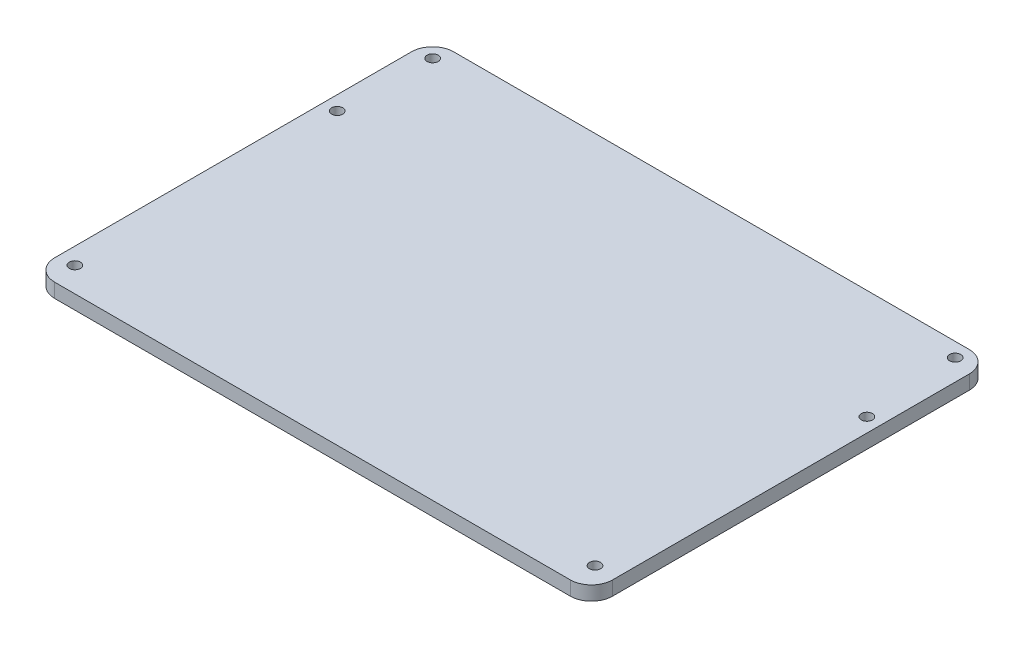
ISO-10303-21;
HEADER;
FILE_DESCRIPTION(('STEP AP214'),'2;1');
FILE_NAME('part.step','',(''),(''),'','','');
FILE_SCHEMA(('AUTOMOTIVE_DESIGN { 1 0 10303 214 1 1 1 1 }'));
ENDSEC;
DATA;
#1=APPLICATION_CONTEXT('core data for automotive mechanical design processes');
#2=APPLICATION_PROTOCOL_DEFINITION('international standard','automotive_design',2000,#1);
#3=PRODUCT_CONTEXT('',#1,'mechanical');
#4=PRODUCT('Part','Part','',(#3));
#5=PRODUCT_RELATED_PRODUCT_CATEGORY('part','',(#4));
#6=PRODUCT_DEFINITION_FORMATION('','',#4);
#7=PRODUCT_DEFINITION_CONTEXT('part definition',#1,'design');
#8=PRODUCT_DEFINITION('design','',#6,#7);
#9=PRODUCT_DEFINITION_SHAPE('','',#8);
#10=(LENGTH_UNIT() NAMED_UNIT(*) SI_UNIT(.MILLI.,.METRE.));
#11=(NAMED_UNIT(*) PLANE_ANGLE_UNIT() SI_UNIT($,.RADIAN.));
#12=(NAMED_UNIT(*) SI_UNIT($,.STERADIAN.) SOLID_ANGLE_UNIT());
#13=UNCERTAINTY_MEASURE_WITH_UNIT(LENGTH_MEASURE(1.E-05),#10,'distance_accuracy_value','');
#14=(GEOMETRIC_REPRESENTATION_CONTEXT(3) GLOBAL_UNCERTAINTY_ASSIGNED_CONTEXT((#13)) GLOBAL_UNIT_ASSIGNED_CONTEXT((#10,
#11,#12)) REPRESENTATION_CONTEXT('',''));
#15=CARTESIAN_POINT('',(0.,0.,0.));
#16=DIRECTION('',(0.,0.,1.));
#17=DIRECTION('',(1.,0.,0.));
#18=AXIS2_PLACEMENT_3D('',#15,#16,#17);
#19=CARTESIAN_POINT('',(-75.9922676579926,5.08,110.346003717472));
#20=DIRECTION('',(0.,1.,0.));
#21=DIRECTION('',(0.,0.,1.));
#22=AXIS2_PLACEMENT_3D('',#19,#20,#21);
#23=PLANE('',#22);
#24=CARTESIAN_POINT('',(109.427732342007,5.08,109.076003717472));
#25=DIRECTION('',(0.,1.,0.));
#26=DIRECTION('',(0.,0.,1.));
#27=AXIS2_PLACEMENT_3D('',#24,#25,#26);
#28=CIRCLE('',#27,2.);
#29=CARTESIAN_POINT('',(109.427732342007,5.08,111.076003717472));
#30=VERTEX_POINT('',#29);
#31=EDGE_CURVE('E192',#30,#30,#28,.T.);
#32=ORIENTED_EDGE('',*,*,#31,.F.);
#33=EDGE_LOOP('',(#32));
#34=FACE_BOUND('',#33,.T.);
#35=CARTESIAN_POINT('',(-77.6432676579926,5.08,109.076003717472));
#36=DIRECTION('',(0.,1.,0.));
#37=DIRECTION('',(0.,0.,1.));
#38=AXIS2_PLACEMENT_3D('',#35,#36,#37);
#39=CIRCLE('',#38,2.000000064);
#40=CARTESIAN_POINT('',(-77.6432676579926,5.08,111.076003781472));
#41=VERTEX_POINT('',#40);
#42=EDGE_CURVE('E199',#41,#41,#39,.T.);
#43=ORIENTED_EDGE('',*,*,#42,.F.);
#44=EDGE_LOOP('',(#43));
#45=FACE_BOUND('',#44,.T.);
#46=CARTESIAN_POINT('',(-78.5322676579926,5.08,13.8260037174722));
#47=DIRECTION('',(0.,1.,0.));
#48=DIRECTION('',(0.,0.,1.));
#49=AXIS2_PLACEMENT_3D('',#46,#47,#48);
#50=CIRCLE('',#49,2.);
#51=CARTESIAN_POINT('',(-78.5322676579926,5.08,15.8260037174722));
#52=VERTEX_POINT('',#51);
#53=EDGE_CURVE('E186',#52,#52,#50,.T.);
#54=ORIENTED_EDGE('',*,*,#53,.F.);
#55=EDGE_LOOP('',(#54));
#56=FACE_BOUND('',#55,.T.);
#57=CARTESIAN_POINT('',(-75.9922676579926,5.08,110.346003717472));
#58=DIRECTION('',(0.,1.,0.));
#59=DIRECTION('',(0.,0.,1.));
#60=AXIS2_PLACEMENT_3D('',#57,#58,#59);
#61=CIRCLE('',#60,7.62);
#62=CARTESIAN_POINT('',(-83.6122676579926,5.08,110.346003717472));
#63=VERTEX_POINT('',#62);
#64=CARTESIAN_POINT('',(-75.9922676579925,5.08,117.966003717472));
#65=VERTEX_POINT('',#64);
#66=EDGE_CURVE('E146',#63,#65,#61,.T.);
#67=ORIENTED_EDGE('',*,*,#66,.T.);
#68=DIRECTION('',(1.,0.,0.));
#69=VECTOR('',#68,1.);
#70=CARTESIAN_POINT('',(-75.9922676579925,5.08,117.966003717472));
#71=LINE('',#70,#69);
#72=CARTESIAN_POINT('',(109.427732342007,5.08,117.966003717472));
#73=VERTEX_POINT('',#72);
#74=EDGE_CURVE('E94',#65,#73,#71,.T.);
#75=ORIENTED_EDGE('',*,*,#74,.T.);
#76=CARTESIAN_POINT('',(109.427732342007,5.08,110.346003717472));
#77=DIRECTION('',(0.,1.,0.));
#78=DIRECTION('',(0.,0.,-1.));
#79=AXIS2_PLACEMENT_3D('',#76,#77,#78);
#80=CIRCLE('',#79,7.62000000000002);
#81=CARTESIAN_POINT('',(117.047732342007,5.08,110.346003717472));
#82=VERTEX_POINT('',#81);
#83=EDGE_CURVE('E161',#73,#82,#80,.T.);
#84=ORIENTED_EDGE('',*,*,#83,.T.);
#85=DIRECTION('',(0.,0.,-1.));
#86=VECTOR('',#85,1.);
#87=CARTESIAN_POINT('',(117.047732342007,5.08,-17.9239962825279));
#88=LINE('',#87,#86);
#89=CARTESIAN_POINT('',(117.047732342007,5.08,-17.9239962825279));
#90=VERTEX_POINT('',#89);
#91=EDGE_CURVE('E174',#82,#90,#88,.T.);
#92=ORIENTED_EDGE('',*,*,#91,.T.);
#93=CARTESIAN_POINT('',(109.427732342007,5.08,-17.9239962825279));
#94=DIRECTION('',(0.,1.,0.));
#95=DIRECTION('',(0.,0.,-1.));
#96=AXIS2_PLACEMENT_3D('',#93,#94,#95);
#97=CIRCLE('',#96,7.62000000000001);
#98=CARTESIAN_POINT('',(109.427732342007,5.08,-25.5439962825279));
#99=VERTEX_POINT('',#98);
#100=EDGE_CURVE('E113',#90,#99,#97,.T.);
#101=ORIENTED_EDGE('',*,*,#100,.T.);
#102=DIRECTION('',(-1.,0.,0.));
#103=VECTOR('',#102,1.);
#104=CARTESIAN_POINT('',(-75.9922676579926,5.08,-25.5439962825279));
#105=LINE('',#104,#103);
#106=CARTESIAN_POINT('',(-75.9922676579926,5.08,-25.5439962825279));
#107=VERTEX_POINT('',#106);
#108=EDGE_CURVE('E107',#99,#107,#105,.T.);
#109=ORIENTED_EDGE('',*,*,#108,.T.);
#110=CARTESIAN_POINT('',(-75.9922676579926,5.08,-17.9239962825279));
#111=DIRECTION('',(0.,1.,0.));
#112=DIRECTION('',(0.,0.,-1.));
#113=AXIS2_PLACEMENT_3D('',#110,#111,#112);
#114=CIRCLE('',#113,7.62);
#115=CARTESIAN_POINT('',(-83.6122676579926,5.08,-17.9239962825279));
#116=VERTEX_POINT('',#115);
#117=EDGE_CURVE('E111',#107,#116,#114,.T.);
#118=ORIENTED_EDGE('',*,*,#117,.T.);
#119=DIRECTION('',(0.,0.,1.));
#120=VECTOR('',#119,1.);
#121=CARTESIAN_POINT('',(-83.6122676579926,5.08,-17.9239962825279));
#122=LINE('',#121,#120);
#123=EDGE_CURVE('E51',#116,#63,#122,.T.);
#124=ORIENTED_EDGE('',*,*,#123,.T.);
#125=EDGE_LOOP('',(#67,#75,#84,#92,#101,#109,#118,#124));
#126=FACE_BOUND('',#125,.T.);
#127=CARTESIAN_POINT('',(-77.7702676579925,5.08,-19.7379191033778));
#128=DIRECTION('',(0.,1.,0.));
#129=DIRECTION('',(0.,0.,1.));
#130=AXIS2_PLACEMENT_3D('',#127,#128,#129);
#131=CIRCLE('',#130,2.);
#132=CARTESIAN_POINT('',(-77.7702676579925,5.08,-17.7379191033778));
#133=VERTEX_POINT('',#132);
#134=EDGE_CURVE('E180',#133,#133,#131,.T.);
#135=ORIENTED_EDGE('',*,*,#134,.F.);
#136=EDGE_LOOP('',(#135));
#137=FACE_BOUND('',#136,.T.);
#138=CARTESIAN_POINT('',(109.427732342007,5.08,-20.4639962825279));
#139=DIRECTION('',(0.,1.,0.));
#140=DIRECTION('',(0.,0.,1.));
#141=AXIS2_PLACEMENT_3D('',#138,#139,#140);
#142=CIRCLE('',#141,2.);
#143=CARTESIAN_POINT('',(109.427732342007,5.08,-18.4639962825279));
#144=VERTEX_POINT('',#143);
#145=EDGE_CURVE('E204',#144,#144,#142,.T.);
#146=ORIENTED_EDGE('',*,*,#145,.F.);
#147=EDGE_LOOP('',(#146));
#148=FACE_BOUND('',#147,.T.);
#149=CARTESIAN_POINT('',(111.967732342007,5.08,13.8260037174722));
#150=DIRECTION('',(0.,1.,0.));
#151=DIRECTION('',(0.,0.,1.));
#152=AXIS2_PLACEMENT_3D('',#149,#150,#151);
#153=CIRCLE('',#152,2.);
#154=CARTESIAN_POINT('',(111.967732342007,5.08,15.8260037174722));
#155=VERTEX_POINT('',#154);
#156=EDGE_CURVE('E210',#155,#155,#153,.F.);
#157=ORIENTED_EDGE('',*,*,#156,.T.);
#158=EDGE_LOOP('',(#157));
#159=FACE_BOUND('',#158,.T.);
#160=ADVANCED_FACE('F34',(#34,#45,#56,#126,#137,#148,#159),#23,.T.);
#161=CARTESIAN_POINT('',(-75.9922676579926,0.,110.346003717472));
#162=DIRECTION('',(0.,1.,0.));
#163=DIRECTION('',(0.,0.,1.));
#164=AXIS2_PLACEMENT_3D('',#161,#162,#163);
#165=PLANE('',#164);
#166=CARTESIAN_POINT('',(109.427732342007,0.,109.076003717472));
#167=DIRECTION('',(0.,1.,0.));
#168=DIRECTION('',(0.,0.,1.));
#169=AXIS2_PLACEMENT_3D('',#166,#167,#168);
#170=CIRCLE('',#169,2.);
#171=CARTESIAN_POINT('',(109.427732342007,0.,111.076003717472));
#172=VERTEX_POINT('',#171);
#173=EDGE_CURVE('E195',#172,#172,#170,.T.);
#174=ORIENTED_EDGE('',*,*,#173,.T.);
#175=EDGE_LOOP('',(#174));
#176=FACE_BOUND('',#175,.T.);
#177=CARTESIAN_POINT('',(-77.6432676579926,0.,109.076003717472));
#178=DIRECTION('',(0.,1.,0.));
#179=DIRECTION('',(0.,0.,1.));
#180=AXIS2_PLACEMENT_3D('',#177,#178,#179);
#181=CIRCLE('',#180,2.000000064);
#182=CARTESIAN_POINT('',(-77.6432676579926,0.,111.076003781472));
#183=VERTEX_POINT('',#182);
#184=EDGE_CURVE('E189',#183,#183,#181,.T.);
#185=ORIENTED_EDGE('',*,*,#184,.T.);
#186=EDGE_LOOP('',(#185));
#187=FACE_BOUND('',#186,.T.);
#188=CARTESIAN_POINT('',(-78.5322676579926,0.,13.8260037174722));
#189=DIRECTION('',(0.,1.,0.));
#190=DIRECTION('',(0.,0.,1.));
#191=AXIS2_PLACEMENT_3D('',#188,#189,#190);
#192=CIRCLE('',#191,2.);
#193=CARTESIAN_POINT('',(-78.5322676579926,0.,15.8260037174722));
#194=VERTEX_POINT('',#193);
#195=EDGE_CURVE('E183',#194,#194,#192,.T.);
#196=ORIENTED_EDGE('',*,*,#195,.T.);
#197=EDGE_LOOP('',(#196));
#198=FACE_BOUND('',#197,.T.);
#199=CARTESIAN_POINT('',(109.427732342007,0.,-20.4639962825279));
#200=DIRECTION('',(0.,1.,0.));
#201=DIRECTION('',(0.,0.,1.));
#202=AXIS2_PLACEMENT_3D('',#199,#200,#201);
#203=CIRCLE('',#202,2.);
#204=CARTESIAN_POINT('',(109.427732342007,0.,-18.4639962825279));
#205=VERTEX_POINT('',#204);
#206=EDGE_CURVE('E207',#205,#205,#203,.T.);
#207=ORIENTED_EDGE('',*,*,#206,.T.);
#208=EDGE_LOOP('',(#207));
#209=FACE_BOUND('',#208,.T.);
#210=CARTESIAN_POINT('',(-77.7702676579925,0.,-19.7379191033778));
#211=DIRECTION('',(0.,1.,0.));
#212=DIRECTION('',(0.,0.,1.));
#213=AXIS2_PLACEMENT_3D('',#210,#211,#212);
#214=CIRCLE('',#213,2.);
#215=CARTESIAN_POINT('',(-77.7702676579925,0.,-17.7379191033778));
#216=VERTEX_POINT('',#215);
#217=EDGE_CURVE('E135',#216,#216,#214,.T.);
#218=ORIENTED_EDGE('',*,*,#217,.T.);
#219=EDGE_LOOP('',(#218));
#220=FACE_BOUND('',#219,.T.);
#221=CARTESIAN_POINT('',(-75.9922676579926,0.,110.346003717472));
#222=DIRECTION('',(0.,1.,0.));
#223=DIRECTION('',(0.,0.,1.));
#224=AXIS2_PLACEMENT_3D('',#221,#222,#223);
#225=CIRCLE('',#224,7.62);
#226=CARTESIAN_POINT('',(-83.6122676579926,0.,110.346003717472));
#227=VERTEX_POINT('',#226);
#228=CARTESIAN_POINT('',(-75.9922676579925,0.,117.966003717472));
#229=VERTEX_POINT('',#228);
#230=EDGE_CURVE('E131',#227,#229,#225,.T.);
#231=ORIENTED_EDGE('',*,*,#230,.F.);
#232=DIRECTION('',(0.,0.,1.));
#233=VECTOR('',#232,1.);
#234=CARTESIAN_POINT('',(-83.6122676579926,0.,-17.9239962825279));
#235=LINE('',#234,#233);
#236=CARTESIAN_POINT('',(-83.6122676579926,0.,-17.9239962825279));
#237=VERTEX_POINT('',#236);
#238=EDGE_CURVE('E86',#237,#227,#235,.T.);
#239=ORIENTED_EDGE('',*,*,#238,.F.);
#240=CARTESIAN_POINT('',(-75.9922676579926,0.,-17.9239962825279));
#241=DIRECTION('',(0.,1.,0.));
#242=DIRECTION('',(0.,0.,-1.));
#243=AXIS2_PLACEMENT_3D('',#240,#241,#242);
#244=CIRCLE('',#243,7.62);
#245=CARTESIAN_POINT('',(-75.9922676579926,0.,-25.5439962825279));
#246=VERTEX_POINT('',#245);
#247=EDGE_CURVE('E80',#246,#237,#244,.T.);
#248=ORIENTED_EDGE('',*,*,#247,.F.);
#249=DIRECTION('',(-1.,0.,0.));
#250=VECTOR('',#249,1.);
#251=CARTESIAN_POINT('',(-75.9922676579926,0.,-25.5439962825279));
#252=LINE('',#251,#250);
#253=CARTESIAN_POINT('',(109.427732342007,0.,-25.5439962825279));
#254=VERTEX_POINT('',#253);
#255=EDGE_CURVE('E121',#254,#246,#252,.T.);
#256=ORIENTED_EDGE('',*,*,#255,.F.);
#257=CARTESIAN_POINT('',(109.427732342007,0.,-17.9239962825279));
#258=DIRECTION('',(0.,1.,0.));
#259=DIRECTION('',(0.,0.,-1.));
#260=AXIS2_PLACEMENT_3D('',#257,#258,#259);
#261=CIRCLE('',#260,7.62000000000001);
#262=CARTESIAN_POINT('',(117.047732342007,0.,-17.9239962825279));
#263=VERTEX_POINT('',#262);
#264=EDGE_CURVE('E141',#263,#254,#261,.T.);
#265=ORIENTED_EDGE('',*,*,#264,.F.);
#266=DIRECTION('',(0.,0.,-1.));
#267=VECTOR('',#266,1.);
#268=CARTESIAN_POINT('',(117.047732342007,0.,-17.9239962825279));
#269=LINE('',#268,#267);
#270=CARTESIAN_POINT('',(117.047732342007,0.,110.346003717472));
#271=VERTEX_POINT('',#270);
#272=EDGE_CURVE('E139',#271,#263,#269,.T.);
#273=ORIENTED_EDGE('',*,*,#272,.F.);
#274=CARTESIAN_POINT('',(109.427732342007,0.,110.346003717472));
#275=DIRECTION('',(0.,1.,0.));
#276=DIRECTION('',(0.,0.,-1.));
#277=AXIS2_PLACEMENT_3D('',#274,#275,#276);
#278=CIRCLE('',#277,7.62000000000002);
#279=CARTESIAN_POINT('',(109.427732342007,0.,117.966003717472));
#280=VERTEX_POINT('',#279);
#281=EDGE_CURVE('E137',#280,#271,#278,.T.);
#282=ORIENTED_EDGE('',*,*,#281,.F.);
#283=DIRECTION('',(1.,0.,0.));
#284=VECTOR('',#283,1.);
#285=CARTESIAN_POINT('',(-75.9922676579925,0.,117.966003717472));
#286=LINE('',#285,#284);
#287=EDGE_CURVE('E134',#229,#280,#286,.T.);
#288=ORIENTED_EDGE('',*,*,#287,.F.);
#289=EDGE_LOOP('',(#231,#239,#248,#256,#265,#273,#282,#288));
#290=FACE_BOUND('',#289,.T.);
#291=CARTESIAN_POINT('',(111.967732342007,0.,13.8260037174722));
#292=DIRECTION('',(0.,1.,0.));
#293=DIRECTION('',(0.,0.,1.));
#294=AXIS2_PLACEMENT_3D('',#291,#292,#293);
#295=CIRCLE('',#294,2.);
#296=CARTESIAN_POINT('',(111.967732342007,0.,15.8260037174722));
#297=VERTEX_POINT('',#296);
#298=EDGE_CURVE('E196',#297,#297,#295,.F.);
#299=ORIENTED_EDGE('',*,*,#298,.F.);
#300=EDGE_LOOP('',(#299));
#301=FACE_BOUND('',#300,.T.);
#302=ADVANCED_FACE('F165',(#176,#187,#198,#209,#220,#290,#301),#165,.F.);
#303=CARTESIAN_POINT('',(-75.9922676579926,5.08,110.346003717472));
#304=DIRECTION('',(0.,-1.,0.));
#305=DIRECTION('',(0.,0.,-1.));
#306=AXIS2_PLACEMENT_3D('',#303,#304,#305);
#307=CYLINDRICAL_SURFACE('',#306,7.62);
#308=ORIENTED_EDGE('',*,*,#230,.T.);
#309=DIRECTION('',(0.,-1.,0.));
#310=VECTOR('',#309,1.);
#311=CARTESIAN_POINT('',(-75.9922676579925,5.08,117.966003717472));
#312=LINE('',#311,#310);
#313=EDGE_CURVE('E11',#65,#229,#312,.T.);
#314=ORIENTED_EDGE('',*,*,#313,.F.);
#315=ORIENTED_EDGE('',*,*,#66,.F.);
#316=DIRECTION('',(0.,-1.,0.));
#317=VECTOR('',#316,1.);
#318=CARTESIAN_POINT('',(-83.6122676579926,5.08,110.346003717472));
#319=LINE('',#318,#317);
#320=EDGE_CURVE('E127',#63,#227,#319,.T.);
#321=ORIENTED_EDGE('',*,*,#320,.T.);
#322=EDGE_LOOP('',(#308,#314,#315,#321));
#323=FACE_BOUND('',#322,.T.);
#324=ADVANCED_FACE('F36',(#323),#307,.T.);
#325=CARTESIAN_POINT('',(-75.9922676579925,5.08,117.966003717472));
#326=DIRECTION('',(0.,0.,-1.));
#327=DIRECTION('',(-1.,0.,0.));
#328=AXIS2_PLACEMENT_3D('',#325,#326,#327);
#329=PLANE('',#328);
#330=ORIENTED_EDGE('',*,*,#287,.T.);
#331=DIRECTION('',(0.,-1.,0.));
#332=VECTOR('',#331,1.);
#333=CARTESIAN_POINT('',(109.427732342007,5.08,117.966003717472));
#334=LINE('',#333,#332);
#335=EDGE_CURVE('E43',#73,#280,#334,.T.);
#336=ORIENTED_EDGE('',*,*,#335,.F.);
#337=ORIENTED_EDGE('',*,*,#74,.F.);
#338=ORIENTED_EDGE('',*,*,#313,.T.);
#339=EDGE_LOOP('',(#330,#336,#337,#338));
#340=FACE_BOUND('',#339,.T.);
#341=ADVANCED_FACE('F225',(#340),#329,.F.);
#342=CARTESIAN_POINT('',(109.427732342007,5.08,110.346003717472));
#343=DIRECTION('',(0.,-1.,0.));
#344=DIRECTION('',(0.,0.,-1.));
#345=AXIS2_PLACEMENT_3D('',#342,#343,#344);
#346=CYLINDRICAL_SURFACE('',#345,7.62000000000002);
#347=ORIENTED_EDGE('',*,*,#281,.T.);
#348=DIRECTION('',(0.,-1.,0.));
#349=VECTOR('',#348,1.);
#350=CARTESIAN_POINT('',(117.047732342007,5.08,110.346003717472));
#351=LINE('',#350,#349);
#352=EDGE_CURVE('E153',#82,#271,#351,.T.);
#353=ORIENTED_EDGE('',*,*,#352,.F.);
#354=ORIENTED_EDGE('',*,*,#83,.F.);
#355=ORIENTED_EDGE('',*,*,#335,.T.);
#356=EDGE_LOOP('',(#347,#353,#354,#355));
#357=FACE_BOUND('',#356,.T.);
#358=ADVANCED_FACE('F159',(#357),#346,.T.);
#359=CARTESIAN_POINT('',(117.047732342007,5.08,-17.9239962825279));
#360=DIRECTION('',(-1.,0.,0.));
#361=DIRECTION('',(0.,0.,1.));
#362=AXIS2_PLACEMENT_3D('',#359,#360,#361);
#363=PLANE('',#362);
#364=ORIENTED_EDGE('',*,*,#272,.T.);
#365=DIRECTION('',(0.,-1.,0.));
#366=VECTOR('',#365,1.);
#367=CARTESIAN_POINT('',(117.047732342007,5.08,-17.9239962825279));
#368=LINE('',#367,#366);
#369=EDGE_CURVE('E150',#90,#263,#368,.T.);
#370=ORIENTED_EDGE('',*,*,#369,.F.);
#371=ORIENTED_EDGE('',*,*,#91,.F.);
#372=ORIENTED_EDGE('',*,*,#352,.T.);
#373=EDGE_LOOP('',(#364,#370,#371,#372));
#374=FACE_BOUND('',#373,.T.);
#375=ADVANCED_FACE('F170',(#374),#363,.F.);
#376=CARTESIAN_POINT('',(109.427732342007,5.08,-17.9239962825279));
#377=DIRECTION('',(0.,-1.,0.));
#378=DIRECTION('',(0.,0.,-1.));
#379=AXIS2_PLACEMENT_3D('',#376,#377,#378);
#380=CYLINDRICAL_SURFACE('',#379,7.62000000000001);
#381=ORIENTED_EDGE('',*,*,#264,.T.);
#382=DIRECTION('',(0.,-1.,0.));
#383=VECTOR('',#382,1.);
#384=CARTESIAN_POINT('',(109.427732342007,5.08,-25.5439962825279));
#385=LINE('',#384,#383);
#386=EDGE_CURVE('E122',#99,#254,#385,.T.);
#387=ORIENTED_EDGE('',*,*,#386,.F.);
#388=ORIENTED_EDGE('',*,*,#100,.F.);
#389=ORIENTED_EDGE('',*,*,#369,.T.);
#390=EDGE_LOOP('',(#381,#387,#388,#389));
#391=FACE_BOUND('',#390,.T.);
#392=ADVANCED_FACE('F173',(#391),#380,.T.);
#393=CARTESIAN_POINT('',(-75.9922676579926,5.08,-25.5439962825279));
#394=DIRECTION('',(0.,0.,1.));
#395=DIRECTION('',(1.,0.,0.));
#396=AXIS2_PLACEMENT_3D('',#393,#394,#395);
#397=PLANE('',#396);
#398=ORIENTED_EDGE('',*,*,#255,.T.);
#399=DIRECTION('',(0.,-1.,0.));
#400=VECTOR('',#399,1.);
#401=CARTESIAN_POINT('',(-75.9922676579926,5.08,-25.5439962825279));
#402=LINE('',#401,#400);
#403=EDGE_CURVE('E118',#107,#246,#402,.T.);
#404=ORIENTED_EDGE('',*,*,#403,.F.);
#405=ORIENTED_EDGE('',*,*,#108,.F.);
#406=ORIENTED_EDGE('',*,*,#386,.T.);
#407=EDGE_LOOP('',(#398,#404,#405,#406));
#408=FACE_BOUND('',#407,.T.);
#409=ADVANCED_FACE('F119',(#408),#397,.F.);
#410=CARTESIAN_POINT('',(-75.9922676579926,5.08,-17.9239962825279));
#411=DIRECTION('',(0.,-1.,0.));
#412=DIRECTION('',(0.,0.,-1.));
#413=AXIS2_PLACEMENT_3D('',#410,#411,#412);
#414=CYLINDRICAL_SURFACE('',#413,7.62);
#415=ORIENTED_EDGE('',*,*,#247,.T.);
#416=DIRECTION('',(0.,-1.,0.));
#417=VECTOR('',#416,1.);
#418=CARTESIAN_POINT('',(-83.6122676579926,5.08,-17.9239962825279));
#419=LINE('',#418,#417);
#420=EDGE_CURVE('E123',#116,#237,#419,.T.);
#421=ORIENTED_EDGE('',*,*,#420,.F.);
#422=ORIENTED_EDGE('',*,*,#117,.F.);
#423=ORIENTED_EDGE('',*,*,#403,.T.);
#424=EDGE_LOOP('',(#415,#421,#422,#423));
#425=FACE_BOUND('',#424,.T.);
#426=ADVANCED_FACE('F125',(#425),#414,.T.);
#427=CARTESIAN_POINT('',(-83.6122676579926,5.08,-17.9239962825279));
#428=DIRECTION('',(1.,0.,0.));
#429=DIRECTION('',(0.,0.,-1.));
#430=AXIS2_PLACEMENT_3D('',#427,#428,#429);
#431=PLANE('',#430);
#432=ORIENTED_EDGE('',*,*,#238,.T.);
#433=ORIENTED_EDGE('',*,*,#320,.F.);
#434=ORIENTED_EDGE('',*,*,#123,.F.);
#435=ORIENTED_EDGE('',*,*,#420,.T.);
#436=EDGE_LOOP('',(#432,#433,#434,#435));
#437=FACE_BOUND('',#436,.T.);
#438=ADVANCED_FACE('F232',(#437),#431,.F.);
#439=CARTESIAN_POINT('',(-77.7702676579925,0.,-19.7379191033778));
#440=DIRECTION('',(0.,1.,0.));
#441=DIRECTION('',(0.,0.,1.));
#442=AXIS2_PLACEMENT_3D('',#439,#440,#441);
#443=CYLINDRICAL_SURFACE('',#442,2.);
#444=ORIENTED_EDGE('',*,*,#217,.F.);
#445=EDGE_LOOP('',(#444));
#446=FACE_BOUND('',#445,.T.);
#447=ORIENTED_EDGE('',*,*,#134,.T.);
#448=EDGE_LOOP('',(#447));
#449=FACE_BOUND('',#448,.T.);
#450=ADVANCED_FACE('F235',(#446,#449),#443,.F.);
#451=CARTESIAN_POINT('',(109.427732342007,0.,-20.4639962825279));
#452=DIRECTION('',(0.,1.,0.));
#453=DIRECTION('',(0.,0.,1.));
#454=AXIS2_PLACEMENT_3D('',#451,#452,#453);
#455=CYLINDRICAL_SURFACE('',#454,2.);
#456=ORIENTED_EDGE('',*,*,#206,.F.);
#457=EDGE_LOOP('',(#456));
#458=FACE_BOUND('',#457,.T.);
#459=ORIENTED_EDGE('',*,*,#145,.T.);
#460=EDGE_LOOP('',(#459));
#461=FACE_BOUND('',#460,.T.);
#462=ADVANCED_FACE('F283',(#458,#461),#455,.F.);
#463=CARTESIAN_POINT('',(111.967732342007,0.,13.8260037174722));
#464=DIRECTION('',(0.,1.,0.));
#465=DIRECTION('',(0.,0.,1.));
#466=AXIS2_PLACEMENT_3D('',#463,#464,#465);
#467=CYLINDRICAL_SURFACE('',#466,2.);
#468=ORIENTED_EDGE('',*,*,#298,.T.);
#469=EDGE_LOOP('',(#468));
#470=FACE_BOUND('',#469,.T.);
#471=ORIENTED_EDGE('',*,*,#156,.F.);
#472=EDGE_LOOP('',(#471));
#473=FACE_BOUND('',#472,.T.);
#474=ADVANCED_FACE('F216',(#470,#473),#467,.F.);
#475=CARTESIAN_POINT('',(-78.5322676579926,0.,13.8260037174722));
#476=DIRECTION('',(0.,1.,0.));
#477=DIRECTION('',(0.,0.,1.));
#478=AXIS2_PLACEMENT_3D('',#475,#476,#477);
#479=CYLINDRICAL_SURFACE('',#478,2.);
#480=ORIENTED_EDGE('',*,*,#195,.F.);
#481=EDGE_LOOP('',(#480));
#482=FACE_BOUND('',#481,.T.);
#483=ORIENTED_EDGE('',*,*,#53,.T.);
#484=EDGE_LOOP('',(#483));
#485=FACE_BOUND('',#484,.T.);
#486=ADVANCED_FACE('F297',(#482,#485),#479,.F.);
#487=CARTESIAN_POINT('',(-77.6432676579926,0.,109.076003717472));
#488=DIRECTION('',(0.,1.,0.));
#489=DIRECTION('',(0.,0.,1.));
#490=AXIS2_PLACEMENT_3D('',#487,#488,#489);
#491=CYLINDRICAL_SURFACE('',#490,2.000000064);
#492=ORIENTED_EDGE('',*,*,#184,.F.);
#493=EDGE_LOOP('',(#492));
#494=FACE_BOUND('',#493,.T.);
#495=ORIENTED_EDGE('',*,*,#42,.T.);
#496=EDGE_LOOP('',(#495));
#497=FACE_BOUND('',#496,.T.);
#498=ADVANCED_FACE('F304',(#494,#497),#491,.F.);
#499=CARTESIAN_POINT('',(109.427732342007,0.,109.076003717472));
#500=DIRECTION('',(0.,1.,0.));
#501=DIRECTION('',(0.,0.,1.));
#502=AXIS2_PLACEMENT_3D('',#499,#500,#501);
#503=CYLINDRICAL_SURFACE('',#502,2.);
#504=ORIENTED_EDGE('',*,*,#173,.F.);
#505=EDGE_LOOP('',(#504));
#506=FACE_BOUND('',#505,.T.);
#507=ORIENTED_EDGE('',*,*,#31,.T.);
#508=EDGE_LOOP('',(#507));
#509=FACE_BOUND('',#508,.T.);
#510=ADVANCED_FACE('F312',(#506,#509),#503,.F.);
#511=CLOSED_SHELL('',(#160,#302,#324,#341,#358,#375,#392,#409,#426,#438,#450,#462,#474,#486,
#498,#510));
#512=MANIFOLD_SOLID_BREP('B2',#511);
#513=ADVANCED_BREP_SHAPE_REPRESENTATION('',(#18,#512),#14);
#514=SHAPE_DEFINITION_REPRESENTATION(#9,#513);
ENDSEC;
END-ISO-10303-21;
